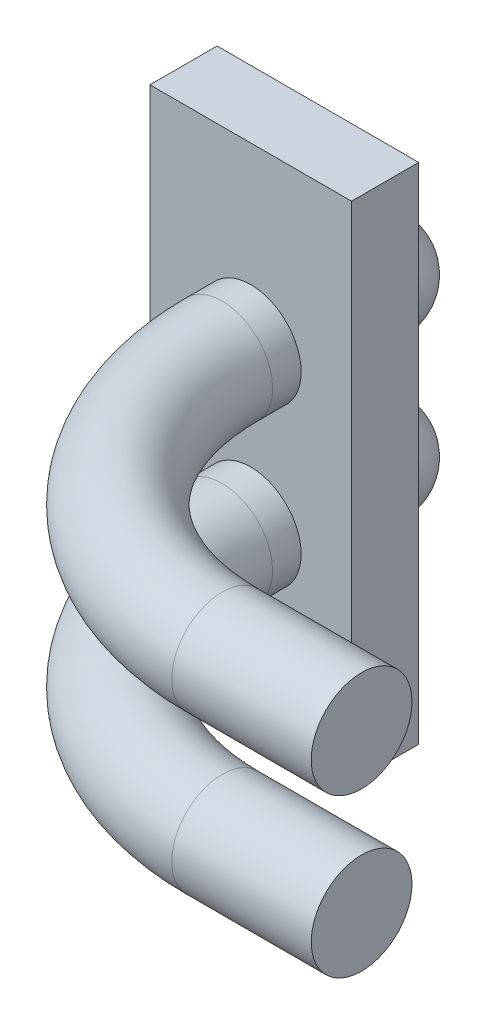
ISO-10303-21;
HEADER;
FILE_DESCRIPTION(('STEP AP214'),'2;1');
FILE_NAME('part.step','',(''),(''),'','','');
FILE_SCHEMA(('AUTOMOTIVE_DESIGN { 1 0 10303 214 1 1 1 1 }'));
ENDSEC;
DATA;
#1=APPLICATION_CONTEXT('core data for automotive mechanical design processes');
#2=APPLICATION_PROTOCOL_DEFINITION('international standard','automotive_design',2000,#1);
#3=PRODUCT_CONTEXT('',#1,'mechanical');
#4=PRODUCT('Part','Part','',(#3));
#5=PRODUCT_RELATED_PRODUCT_CATEGORY('part','',(#4));
#6=PRODUCT_DEFINITION_FORMATION('','',#4);
#7=PRODUCT_DEFINITION_CONTEXT('part definition',#1,'design');
#8=PRODUCT_DEFINITION('design','',#6,#7);
#9=PRODUCT_DEFINITION_SHAPE('','',#8);
#10=(LENGTH_UNIT() NAMED_UNIT(*) SI_UNIT(.MILLI.,.METRE.));
#11=(NAMED_UNIT(*) PLANE_ANGLE_UNIT() SI_UNIT($,.RADIAN.));
#12=(NAMED_UNIT(*) SI_UNIT($,.STERADIAN.) SOLID_ANGLE_UNIT());
#13=UNCERTAINTY_MEASURE_WITH_UNIT(LENGTH_MEASURE(1.E-05),#10,'distance_accuracy_value','');
#14=(GEOMETRIC_REPRESENTATION_CONTEXT(3) GLOBAL_UNCERTAINTY_ASSIGNED_CONTEXT((#13)) GLOBAL_UNIT_ASSIGNED_CONTEXT((#10,
#11,#12)) REPRESENTATION_CONTEXT('',''));
#15=CARTESIAN_POINT('',(0.,0.,0.));
#16=DIRECTION('',(0.,0.,1.));
#17=DIRECTION('',(1.,0.,0.));
#18=AXIS2_PLACEMENT_3D('',#15,#16,#17);
#19=CARTESIAN_POINT('',(3.00000000000001,7.5,2.));
#20=DIRECTION('',(0.,0.,-1.));
#21=DIRECTION('',(-1.,0.,0.));
#22=AXIS2_PLACEMENT_3D('',#19,#20,#21);
#23=PLANE('',#22);
#24=CARTESIAN_POINT('',(0.,-2.35,2.));
#25=DIRECTION('',(0.,0.,1.));
#26=DIRECTION('',(1.,0.,0.));
#27=AXIS2_PLACEMENT_3D('',#24,#25,#26);
#28=CIRCLE('',#27,1.5);
#29=CARTESIAN_POINT('',(1.5,-2.35,2.));
#30=VERTEX_POINT('',#29);
#31=EDGE_CURVE('E43',#30,#30,#28,.T.);
#32=ORIENTED_EDGE('',*,*,#31,.F.);
#33=EDGE_LOOP('',(#32));
#34=FACE_BOUND('',#33,.T.);
#35=DIRECTION('',(0.,1.,0.));
#36=VECTOR('',#35,1.);
#37=CARTESIAN_POINT('',(3.00000000000001,-7.5,2.));
#38=LINE('',#37,#36);
#39=CARTESIAN_POINT('',(3.00000000000001,-7.5,2.));
#40=VERTEX_POINT('',#39);
#41=CARTESIAN_POINT('',(3.00000000000001,7.5,2.));
#42=VERTEX_POINT('',#41);
#43=EDGE_CURVE('E88',#40,#42,#38,.T.);
#44=ORIENTED_EDGE('',*,*,#43,.T.);
#45=DIRECTION('',(-1.,0.,0.));
#46=VECTOR('',#45,1.);
#47=CARTESIAN_POINT('',(-3.,7.5,2.));
#48=LINE('',#47,#46);
#49=CARTESIAN_POINT('',(-3.,7.5,2.));
#50=VERTEX_POINT('',#49);
#51=EDGE_CURVE('E83',#42,#50,#48,.T.);
#52=ORIENTED_EDGE('',*,*,#51,.T.);
#53=DIRECTION('',(0.,-1.,0.));
#54=VECTOR('',#53,1.);
#55=CARTESIAN_POINT('',(-3.,-7.5,2.));
#56=LINE('',#55,#54);
#57=CARTESIAN_POINT('',(-3.,-7.5,2.));
#58=VERTEX_POINT('',#57);
#59=EDGE_CURVE('E86',#50,#58,#56,.T.);
#60=ORIENTED_EDGE('',*,*,#59,.T.);
#61=DIRECTION('',(1.,0.,0.));
#62=VECTOR('',#61,1.);
#63=CARTESIAN_POINT('',(-3.,-7.5,2.));
#64=LINE('',#63,#62);
#65=EDGE_CURVE('E52',#58,#40,#64,.T.);
#66=ORIENTED_EDGE('',*,*,#65,.T.);
#67=EDGE_LOOP('',(#44,#52,#60,#66));
#68=FACE_BOUND('',#67,.T.);
#69=CARTESIAN_POINT('',(0.,2.35,2.));
#70=DIRECTION('',(0.,0.,1.));
#71=DIRECTION('',(1.,0.,0.));
#72=AXIS2_PLACEMENT_3D('',#69,#70,#71);
#73=CIRCLE('',#72,1.5);
#74=CARTESIAN_POINT('',(1.5,2.35,2.));
#75=VERTEX_POINT('',#74);
#76=EDGE_CURVE('E11',#75,#75,#73,.T.);
#77=ORIENTED_EDGE('',*,*,#76,.F.);
#78=EDGE_LOOP('',(#77));
#79=FACE_BOUND('',#78,.T.);
#80=ADVANCED_FACE('F33',(#34,#68,#79),#23,.F.);
#81=CARTESIAN_POINT('',(3.00000000000001,7.5,0.));
#82=DIRECTION('',(0.,0.,-1.));
#83=DIRECTION('',(-1.,0.,0.));
#84=AXIS2_PLACEMENT_3D('',#81,#82,#83);
#85=PLANE('',#84);
#86=CARTESIAN_POINT('',(0.,2.35,0.));
#87=DIRECTION('',(0.,0.,-1.));
#88=DIRECTION('',(-1.,0.,0.));
#89=AXIS2_PLACEMENT_3D('',#86,#87,#88);
#90=CIRCLE('',#89,1.5);
#91=CARTESIAN_POINT('',(-1.5,2.35,0.));
#92=VERTEX_POINT('',#91);
#93=EDGE_CURVE('E106',#92,#92,#90,.T.);
#94=ORIENTED_EDGE('',*,*,#93,.F.);
#95=EDGE_LOOP('',(#94));
#96=FACE_BOUND('',#95,.T.);
#97=DIRECTION('',(0.,1.,0.));
#98=VECTOR('',#97,1.);
#99=CARTESIAN_POINT('',(3.00000000000001,-7.5,0.));
#100=LINE('',#99,#98);
#101=CARTESIAN_POINT('',(3.00000000000001,-7.5,0.));
#102=VERTEX_POINT('',#101);
#103=CARTESIAN_POINT('',(3.00000000000001,7.5,0.));
#104=VERTEX_POINT('',#103);
#105=EDGE_CURVE('E103',#102,#104,#100,.T.);
#106=ORIENTED_EDGE('',*,*,#105,.F.);
#107=DIRECTION('',(1.,0.,0.));
#108=VECTOR('',#107,1.);
#109=CARTESIAN_POINT('',(-3.,-7.5,0.));
#110=LINE('',#109,#108);
#111=CARTESIAN_POINT('',(-3.,-7.5,0.));
#112=VERTEX_POINT('',#111);
#113=EDGE_CURVE('E75',#112,#102,#110,.T.);
#114=ORIENTED_EDGE('',*,*,#113,.F.);
#115=DIRECTION('',(0.,-1.,0.));
#116=VECTOR('',#115,1.);
#117=CARTESIAN_POINT('',(-3.,-7.5,0.));
#118=LINE('',#117,#116);
#119=CARTESIAN_POINT('',(-3.,7.5,0.));
#120=VERTEX_POINT('',#119);
#121=EDGE_CURVE('E69',#120,#112,#118,.T.);
#122=ORIENTED_EDGE('',*,*,#121,.F.);
#123=DIRECTION('',(-1.,0.,0.));
#124=VECTOR('',#123,1.);
#125=CARTESIAN_POINT('',(-3.,7.5,0.));
#126=LINE('',#125,#124);
#127=EDGE_CURVE('E93',#104,#120,#126,.T.);
#128=ORIENTED_EDGE('',*,*,#127,.F.);
#129=EDGE_LOOP('',(#106,#114,#122,#128));
#130=FACE_BOUND('',#129,.T.);
#131=CARTESIAN_POINT('',(0.,-2.35,0.));
#132=DIRECTION('',(0.,0.,-1.));
#133=DIRECTION('',(-1.,0.,0.));
#134=AXIS2_PLACEMENT_3D('',#131,#132,#133);
#135=CIRCLE('',#134,1.5);
#136=CARTESIAN_POINT('',(-1.5,-2.35,0.));
#137=VERTEX_POINT('',#136);
#138=EDGE_CURVE('E133',#137,#137,#135,.T.);
#139=ORIENTED_EDGE('',*,*,#138,.F.);
#140=EDGE_LOOP('',(#139));
#141=FACE_BOUND('',#140,.T.);
#142=ADVANCED_FACE('F141',(#96,#130,#141),#85,.T.);
#143=CARTESIAN_POINT('',(3.00000000000001,-7.5,2.));
#144=DIRECTION('',(-1.,0.,0.));
#145=DIRECTION('',(0.,0.,1.));
#146=AXIS2_PLACEMENT_3D('',#143,#144,#145);
#147=PLANE('',#146);
#148=ORIENTED_EDGE('',*,*,#105,.T.);
#149=DIRECTION('',(0.,0.,-1.));
#150=VECTOR('',#149,1.);
#151=CARTESIAN_POINT('',(3.00000000000001,7.5,2.));
#152=LINE('',#151,#150);
#153=EDGE_CURVE('E94',#42,#104,#152,.T.);
#154=ORIENTED_EDGE('',*,*,#153,.F.);
#155=ORIENTED_EDGE('',*,*,#43,.F.);
#156=DIRECTION('',(0.,0.,-1.));
#157=VECTOR('',#156,1.);
#158=CARTESIAN_POINT('',(3.00000000000001,-7.5,2.));
#159=LINE('',#158,#157);
#160=EDGE_CURVE('E99',#40,#102,#159,.T.);
#161=ORIENTED_EDGE('',*,*,#160,.T.);
#162=EDGE_LOOP('',(#148,#154,#155,#161));
#163=FACE_BOUND('',#162,.T.);
#164=ADVANCED_FACE('F144',(#163),#147,.F.);
#165=CARTESIAN_POINT('',(-3.,7.5,2.));
#166=DIRECTION('',(0.,-1.,0.));
#167=DIRECTION('',(0.,0.,-1.));
#168=AXIS2_PLACEMENT_3D('',#165,#166,#167);
#169=PLANE('',#168);
#170=ORIENTED_EDGE('',*,*,#127,.T.);
#171=DIRECTION('',(0.,0.,-1.));
#172=VECTOR('',#171,1.);
#173=CARTESIAN_POINT('',(-3.,7.5,2.));
#174=LINE('',#173,#172);
#175=EDGE_CURVE('E91',#50,#120,#174,.T.);
#176=ORIENTED_EDGE('',*,*,#175,.F.);
#177=ORIENTED_EDGE('',*,*,#51,.F.);
#178=ORIENTED_EDGE('',*,*,#153,.T.);
#179=EDGE_LOOP('',(#170,#176,#177,#178));
#180=FACE_BOUND('',#179,.T.);
#181=ADVANCED_FACE('F92',(#180),#169,.F.);
#182=CARTESIAN_POINT('',(-3.,-7.5,2.));
#183=DIRECTION('',(1.,0.,0.));
#184=DIRECTION('',(0.,0.,-1.));
#185=AXIS2_PLACEMENT_3D('',#182,#183,#184);
#186=PLANE('',#185);
#187=ORIENTED_EDGE('',*,*,#121,.T.);
#188=DIRECTION('',(0.,0.,-1.));
#189=VECTOR('',#188,1.);
#190=CARTESIAN_POINT('',(-3.,-7.5,2.));
#191=LINE('',#190,#189);
#192=EDGE_CURVE('E95',#58,#112,#191,.T.);
#193=ORIENTED_EDGE('',*,*,#192,.F.);
#194=ORIENTED_EDGE('',*,*,#59,.F.);
#195=ORIENTED_EDGE('',*,*,#175,.T.);
#196=EDGE_LOOP('',(#187,#193,#194,#195));
#197=FACE_BOUND('',#196,.T.);
#198=ADVANCED_FACE('F97',(#197),#186,.F.);
#199=CARTESIAN_POINT('',(-3.,-7.5,2.));
#200=DIRECTION('',(0.,1.,0.));
#201=DIRECTION('',(0.,0.,1.));
#202=AXIS2_PLACEMENT_3D('',#199,#200,#201);
#203=PLANE('',#202);
#204=ORIENTED_EDGE('',*,*,#113,.T.);
#205=ORIENTED_EDGE('',*,*,#160,.F.);
#206=ORIENTED_EDGE('',*,*,#65,.F.);
#207=ORIENTED_EDGE('',*,*,#192,.T.);
#208=EDGE_LOOP('',(#204,#205,#206,#207));
#209=FACE_BOUND('',#208,.T.);
#210=ADVANCED_FACE('F159',(#209),#203,.F.);
#211=CARTESIAN_POINT('',(0.,2.35,-3.));
#212=DIRECTION('',(0.,0.,1.));
#213=DIRECTION('',(1.,0.,0.));
#214=AXIS2_PLACEMENT_3D('',#211,#212,#213);
#215=CYLINDRICAL_SURFACE('',#214,1.5);
#216=CARTESIAN_POINT('',(0.,2.35,-1.5));
#217=DIRECTION('',(0.,0.,1.));
#218=DIRECTION('',(1.,0.,0.));
#219=AXIS2_PLACEMENT_3D('',#216,#217,#218);
#220=CIRCLE('',#219,1.5);
#221=CARTESIAN_POINT('',(1.5,2.35,-1.5));
#222=VERTEX_POINT('',#221);
#223=EDGE_CURVE('E37',#222,#222,#220,.T.);
#224=ORIENTED_EDGE('',*,*,#223,.T.);
#225=EDGE_LOOP('',(#224));
#226=FACE_BOUND('',#225,.T.);
#227=ORIENTED_EDGE('',*,*,#93,.T.);
#228=EDGE_LOOP('',(#227));
#229=FACE_BOUND('',#228,.T.);
#230=ADVANCED_FACE('F139',(#226,#229),#215,.T.);
#231=CARTESIAN_POINT('',(0.,-2.35,-3.));
#232=DIRECTION('',(0.,0.,1.));
#233=DIRECTION('',(1.,0.,0.));
#234=AXIS2_PLACEMENT_3D('',#231,#232,#233);
#235=CYLINDRICAL_SURFACE('',#234,1.5);
#236=CARTESIAN_POINT('',(0.,-2.35,-1.5));
#237=DIRECTION('',(0.,0.,1.));
#238=DIRECTION('',(1.,0.,0.));
#239=AXIS2_PLACEMENT_3D('',#236,#237,#238);
#240=CIRCLE('',#239,1.5);
#241=CARTESIAN_POINT('',(1.5,-2.35,-1.5));
#242=VERTEX_POINT('',#241);
#243=EDGE_CURVE('E112',#242,#242,#240,.T.);
#244=ORIENTED_EDGE('',*,*,#243,.T.);
#245=EDGE_LOOP('',(#244));
#246=FACE_BOUND('',#245,.T.);
#247=ORIENTED_EDGE('',*,*,#138,.T.);
#248=EDGE_LOOP('',(#247));
#249=FACE_BOUND('',#248,.T.);
#250=ADVANCED_FACE('F150',(#246,#249),#235,.T.);
#251=CARTESIAN_POINT('',(0.,-2.35,-1.5));
#252=DIRECTION('',(0.,0.,1.));
#253=DIRECTION('',(1.,0.,0.));
#254=AXIS2_PLACEMENT_3D('',#251,#252,#253);
#255=SPHERICAL_SURFACE('',#254,1.5);
#256=ORIENTED_EDGE('',*,*,#243,.F.);
#257=EDGE_LOOP('',(#256));
#258=FACE_BOUND('',#257,.T.);
#259=ADVANCED_FACE('F152',(#258),#255,.T.);
#260=CARTESIAN_POINT('',(0.,2.35,-1.5));
#261=DIRECTION('',(0.,0.,1.));
#262=DIRECTION('',(1.,0.,0.));
#263=AXIS2_PLACEMENT_3D('',#260,#261,#262);
#264=SPHERICAL_SURFACE('',#263,1.5);
#265=ORIENTED_EDGE('',*,*,#223,.F.);
#266=EDGE_LOOP('',(#265));
#267=FACE_BOUND('',#266,.T.);
#268=ADVANCED_FACE('F35',(#267),#264,.T.);
#269=CARTESIAN_POINT('',(7.5,-2.35,10.35));
#270=DIRECTION('',(1.,0.,0.));
#271=DIRECTION('',(0.,0.,-1.));
#272=AXIS2_PLACEMENT_3D('',#269,#270,#271);
#273=CYLINDRICAL_SURFACE('',#272,1.5);
#274=CARTESIAN_POINT('',(7.5,-2.35,10.35));
#275=DIRECTION('',(1.,0.,0.));
#276=DIRECTION('',(0.,0.,-1.));
#277=AXIS2_PLACEMENT_3D('',#274,#275,#276);
#278=CIRCLE('',#277,1.5);
#279=CARTESIAN_POINT('',(7.5,-2.35,11.85));
#280=VERTEX_POINT('',#279);
#281=EDGE_CURVE('E127',#280,#280,#278,.T.);
#282=ORIENTED_EDGE('',*,*,#281,.T.);
#283=EDGE_LOOP('',(#282));
#284=FACE_BOUND('',#283,.T.);
#285=CARTESIAN_POINT('',(11.65,-2.35,10.35));
#286=DIRECTION('',(1.,0.,0.));
#287=DIRECTION('',(0.,0.,-1.));
#288=AXIS2_PLACEMENT_3D('',#285,#286,#287);
#289=CIRCLE('',#288,1.5);
#290=CARTESIAN_POINT('',(11.65,-2.35,8.85));
#291=VERTEX_POINT('',#290);
#292=EDGE_CURVE('E130',#291,#291,#289,.T.);
#293=ORIENTED_EDGE('',*,*,#292,.F.);
#294=EDGE_LOOP('',(#293));
#295=FACE_BOUND('',#294,.T.);
#296=ADVANCED_FACE('F216',(#284,#295),#273,.T.);
#297=CARTESIAN_POINT('',(7.5,-2.35,2.85));
#298=DIRECTION('',(0.,1.,0.));
#299=DIRECTION('',(0.,0.,1.));
#300=AXIS2_PLACEMENT_3D('',#297,#298,#299);
#301=TOROIDAL_SURFACE('',#300,7.5,1.5);
#302=CARTESIAN_POINT('',(0.,-2.35,2.85));
#303=DIRECTION('',(0.,0.,1.));
#304=DIRECTION('',(1.,0.,0.));
#305=AXIS2_PLACEMENT_3D('',#302,#303,#304);
#306=CIRCLE('',#305,1.5);
#307=CARTESIAN_POINT('',(-1.5,-2.35,2.85));
#308=VERTEX_POINT('',#307);
#309=EDGE_CURVE('E125',#308,#308,#306,.T.);
#310=CARTESIAN_POINT('',(7.5,-2.35,2.85));
#311=DIRECTION('',(0.,1.,0.));
#312=DIRECTION('',(0.,0.,1.));
#313=AXIS2_PLACEMENT_3D('',#310,#311,#312);
#314=CIRCLE('',#313,9.);
#315=EDGE_CURVE('',#308,#280,#314,.T.);
#316=ORIENTED_EDGE('',*,*,#309,.T.);
#317=ORIENTED_EDGE('',*,*,#281,.F.);
#318=ORIENTED_EDGE('',*,*,#315,.T.);
#319=ORIENTED_EDGE('',*,*,#315,.F.);
#320=EDGE_LOOP('',(#316,#318,#317,#319));
#321=FACE_BOUND('',#320,.T.);
#322=ADVANCED_FACE('F230',(#321),#301,.T.);
#323=CARTESIAN_POINT('',(0.,-2.35,2.85));
#324=DIRECTION('',(0.,0.,-1.));
#325=DIRECTION('',(-1.,0.,0.));
#326=AXIS2_PLACEMENT_3D('',#323,#324,#325);
#327=CYLINDRICAL_SURFACE('',#326,1.5);
#328=ORIENTED_EDGE('',*,*,#309,.F.);
#329=EDGE_LOOP('',(#328));
#330=FACE_BOUND('',#329,.T.);
#331=ORIENTED_EDGE('',*,*,#31,.T.);
#332=EDGE_LOOP('',(#331));
#333=FACE_BOUND('',#332,.T.);
#334=ADVANCED_FACE('F239',(#330,#333),#327,.T.);
#335=CARTESIAN_POINT('',(11.65,-2.35,10.35));
#336=DIRECTION('',(1.,0.,0.));
#337=DIRECTION('',(0.,0.,-1.));
#338=AXIS2_PLACEMENT_3D('',#335,#336,#337);
#339=PLANE('',#338);
#340=ORIENTED_EDGE('',*,*,#292,.T.);
#341=EDGE_LOOP('',(#340));
#342=FACE_BOUND('',#341,.T.);
#343=ADVANCED_FACE('F249',(#342),#339,.T.);
#344=CARTESIAN_POINT('',(7.5,2.35,10.35));
#345=DIRECTION('',(1.,0.,0.));
#346=DIRECTION('',(0.,0.,-1.));
#347=AXIS2_PLACEMENT_3D('',#344,#345,#346);
#348=CYLINDRICAL_SURFACE('',#347,1.5);
#349=CARTESIAN_POINT('',(7.5,2.35,10.35));
#350=DIRECTION('',(1.,0.,0.));
#351=DIRECTION('',(0.,0.,-1.));
#352=AXIS2_PLACEMENT_3D('',#349,#350,#351);
#353=CIRCLE('',#352,1.5);
#354=CARTESIAN_POINT('',(7.5,2.35,11.85));
#355=VERTEX_POINT('',#354);
#356=EDGE_CURVE('E307',#355,#355,#353,.T.);
#357=ORIENTED_EDGE('',*,*,#356,.T.);
#358=EDGE_LOOP('',(#357));
#359=FACE_BOUND('',#358,.T.);
#360=CARTESIAN_POINT('',(11.65,2.35,10.35));
#361=DIRECTION('',(1.,0.,0.));
#362=DIRECTION('',(0.,0.,-1.));
#363=AXIS2_PLACEMENT_3D('',#360,#361,#362);
#364=CIRCLE('',#363,1.5);
#365=CARTESIAN_POINT('',(11.65,2.35,8.85));
#366=VERTEX_POINT('',#365);
#367=EDGE_CURVE('E305',#366,#366,#364,.T.);
#368=ORIENTED_EDGE('',*,*,#367,.F.);
#369=EDGE_LOOP('',(#368));
#370=FACE_BOUND('',#369,.T.);
#371=ADVANCED_FACE('F259',(#359,#370),#348,.T.);
#372=CARTESIAN_POINT('',(7.5,2.35,2.85));
#373=DIRECTION('',(0.,1.,0.));
#374=DIRECTION('',(0.,0.,1.));
#375=AXIS2_PLACEMENT_3D('',#372,#373,#374);
#376=TOROIDAL_SURFACE('',#375,7.5,1.5);
#377=CARTESIAN_POINT('',(0.,2.35,2.85));
#378=DIRECTION('',(0.,0.,1.));
#379=DIRECTION('',(1.,0.,0.));
#380=AXIS2_PLACEMENT_3D('',#377,#378,#379);
#381=CIRCLE('',#380,1.5);
#382=CARTESIAN_POINT('',(-1.5,2.35,2.85));
#383=VERTEX_POINT('',#382);
#384=EDGE_CURVE('E310',#383,#383,#381,.T.);
#385=CARTESIAN_POINT('',(7.5,2.35,2.85));
#386=DIRECTION('',(0.,1.,0.));
#387=DIRECTION('',(0.,0.,1.));
#388=AXIS2_PLACEMENT_3D('',#385,#386,#387);
#389=CIRCLE('',#388,9.);
#390=EDGE_CURVE('',#383,#355,#389,.T.);
#391=ORIENTED_EDGE('',*,*,#384,.T.);
#392=ORIENTED_EDGE('',*,*,#356,.F.);
#393=ORIENTED_EDGE('',*,*,#390,.T.);
#394=ORIENTED_EDGE('',*,*,#390,.F.);
#395=EDGE_LOOP('',(#391,#393,#392,#394));
#396=FACE_BOUND('',#395,.T.);
#397=ADVANCED_FACE('F269',(#396),#376,.T.);
#398=CARTESIAN_POINT('',(0.,2.35,2.85));
#399=DIRECTION('',(0.,0.,-1.));
#400=DIRECTION('',(-1.,0.,0.));
#401=AXIS2_PLACEMENT_3D('',#398,#399,#400);
#402=CYLINDRICAL_SURFACE('',#401,1.5);
#403=ORIENTED_EDGE('',*,*,#384,.F.);
#404=EDGE_LOOP('',(#403));
#405=FACE_BOUND('',#404,.T.);
#406=ORIENTED_EDGE('',*,*,#76,.T.);
#407=EDGE_LOOP('',(#406));
#408=FACE_BOUND('',#407,.T.);
#409=ADVANCED_FACE('F279',(#405,#408),#402,.T.);
#410=CARTESIAN_POINT('',(11.65,2.35,10.35));
#411=DIRECTION('',(1.,0.,0.));
#412=DIRECTION('',(0.,0.,-1.));
#413=AXIS2_PLACEMENT_3D('',#410,#411,#412);
#414=PLANE('',#413);
#415=ORIENTED_EDGE('',*,*,#367,.T.);
#416=EDGE_LOOP('',(#415));
#417=FACE_BOUND('',#416,.T.);
#418=ADVANCED_FACE('F289',(#417),#414,.T.);
#419=CLOSED_SHELL('',(#80,#142,#164,#181,#198,#210,#230,#250,#259,#268,#296,#322,#334,#343,#371,
#397,#409,#418));
#420=MANIFOLD_SOLID_BREP('B2',#419);
#421=ADVANCED_BREP_SHAPE_REPRESENTATION('',(#18,#420),#14);
#422=SHAPE_DEFINITION_REPRESENTATION(#9,#421);
ENDSEC;
END-ISO-10303-21;
